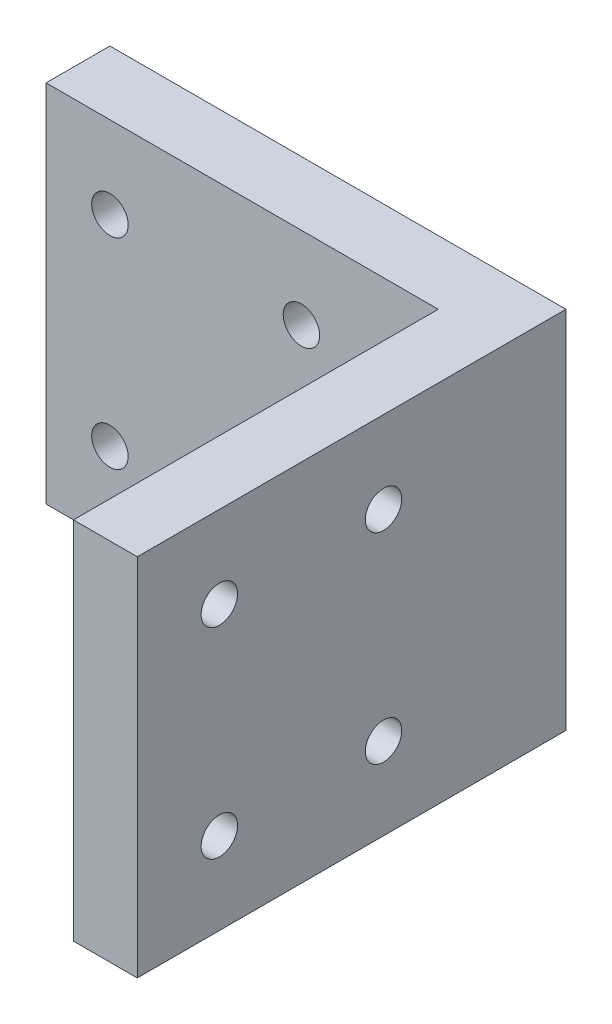
ISO-10303-21;
HEADER;
FILE_DESCRIPTION(('STEP AP214'),'2;1');
FILE_NAME('part.step','',(''),(''),'','','');
FILE_SCHEMA(('AUTOMOTIVE_DESIGN { 1 0 10303 214 1 1 1 1 }'));
ENDSEC;
DATA;
#1=APPLICATION_CONTEXT('core data for automotive mechanical design processes');
#2=APPLICATION_PROTOCOL_DEFINITION('international standard','automotive_design',2000,#1);
#3=PRODUCT_CONTEXT('',#1,'mechanical');
#4=PRODUCT('Part','Part','',(#3));
#5=PRODUCT_RELATED_PRODUCT_CATEGORY('part','',(#4));
#6=PRODUCT_DEFINITION_FORMATION('','',#4);
#7=PRODUCT_DEFINITION_CONTEXT('part definition',#1,'design');
#8=PRODUCT_DEFINITION('design','',#6,#7);
#9=PRODUCT_DEFINITION_SHAPE('','',#8);
#10=(LENGTH_UNIT() NAMED_UNIT(*) SI_UNIT(.MILLI.,.METRE.));
#11=(NAMED_UNIT(*) PLANE_ANGLE_UNIT() SI_UNIT($,.RADIAN.));
#12=(NAMED_UNIT(*) SI_UNIT($,.STERADIAN.) SOLID_ANGLE_UNIT());
#13=UNCERTAINTY_MEASURE_WITH_UNIT(LENGTH_MEASURE(1.E-05),#10,'distance_accuracy_value','');
#14=(GEOMETRIC_REPRESENTATION_CONTEXT(3) GLOBAL_UNCERTAINTY_ASSIGNED_CONTEXT((#13)) GLOBAL_UNIT_ASSIGNED_CONTEXT((#10,
#11,#12)) REPRESENTATION_CONTEXT('',''));
#15=CARTESIAN_POINT('',(0.,0.,0.));
#16=DIRECTION('',(0.,0.,1.));
#17=DIRECTION('',(1.,0.,0.));
#18=AXIS2_PLACEMENT_3D('',#15,#16,#17);
#19=CARTESIAN_POINT('',(-45.2173913043478,8.91304347826087,7.));
#20=DIRECTION('',(1.,0.,0.));
#21=DIRECTION('',(0.,0.,-1.));
#22=AXIS2_PLACEMENT_3D('',#19,#20,#21);
#23=PLANE('',#22);
#24=DIRECTION('',(0.,-1.,0.));
#25=VECTOR('',#24,1.);
#26=CARTESIAN_POINT('',(-45.2173913043478,8.91304347826087,0.));
#27=LINE('',#26,#25);
#28=CARTESIAN_POINT('',(-45.2173913043478,8.91304347826087,0.));
#29=VERTEX_POINT('',#28);
#30=CARTESIAN_POINT('',(-45.2173913043478,-31.0869565217391,0.));
#31=VERTEX_POINT('',#30);
#32=EDGE_CURVE('E91',#29,#31,#27,.T.);
#33=ORIENTED_EDGE('',*,*,#32,.T.);
#34=DIRECTION('',(0.,0.,-1.));
#35=VECTOR('',#34,1.);
#36=CARTESIAN_POINT('',(-45.2173913043478,-31.0869565217391,7.));
#37=LINE('',#36,#35);
#38=CARTESIAN_POINT('',(-45.2173913043478,-31.0869565217391,7.));
#39=VERTEX_POINT('',#38);
#40=EDGE_CURVE('E11',#39,#31,#37,.T.);
#41=ORIENTED_EDGE('',*,*,#40,.F.);
#42=DIRECTION('',(0.,-1.,0.));
#43=VECTOR('',#42,1.);
#44=CARTESIAN_POINT('',(-45.2173913043478,8.91304347826087,7.));
#45=LINE('',#44,#43);
#46=CARTESIAN_POINT('',(-45.2173913043478,8.91304347826087,7.));
#47=VERTEX_POINT('',#46);
#48=EDGE_CURVE('E85',#47,#39,#45,.T.);
#49=ORIENTED_EDGE('',*,*,#48,.F.);
#50=DIRECTION('',(0.,0.,-1.));
#51=VECTOR('',#50,1.);
#52=CARTESIAN_POINT('',(-45.2173913043478,8.91304347826087,7.));
#53=LINE('',#52,#51);
#54=EDGE_CURVE('E77',#47,#29,#53,.T.);
#55=ORIENTED_EDGE('',*,*,#54,.T.);
#56=EDGE_LOOP('',(#33,#41,#49,#55));
#57=FACE_BOUND('',#56,.T.);
#58=ADVANCED_FACE('F33',(#57),#23,.F.);
#59=CARTESIAN_POINT('',(-45.2173913043478,-31.0869565217391,7.));
#60=DIRECTION('',(0.,1.,0.));
#61=DIRECTION('',(0.,0.,1.));
#62=AXIS2_PLACEMENT_3D('',#59,#60,#61);
#63=PLANE('',#62);
#64=DIRECTION('',(1.,0.,0.));
#65=VECTOR('',#64,1.);
#66=CARTESIAN_POINT('',(-45.2173913043478,-31.0869565217391,0.));
#67=LINE('',#66,#65);
#68=CARTESIAN_POINT('',(4.78260869565221,-31.0869565217391,0.));
#69=VERTEX_POINT('',#68);
#70=EDGE_CURVE('E94',#31,#69,#67,.T.);
#71=ORIENTED_EDGE('',*,*,#70,.T.);
#72=DIRECTION('',(0.,0.,-1.));
#73=VECTOR('',#72,1.);
#74=CARTESIAN_POINT('',(4.78260869565221,-31.0869565217391,7.));
#75=LINE('',#74,#73);
#76=CARTESIAN_POINT('',(4.78260869565221,-31.0869565217391,47.));
#77=VERTEX_POINT('',#76);
#78=EDGE_CURVE('E41',#77,#69,#75,.T.);
#79=ORIENTED_EDGE('',*,*,#78,.F.);
#80=DIRECTION('',(1.,0.,0.));
#81=VECTOR('',#80,1.);
#82=CARTESIAN_POINT('',(-2.21739130434779,-31.0869565217391,47.));
#83=LINE('',#82,#81);
#84=CARTESIAN_POINT('',(-2.21739130434779,-31.0869565217391,47.));
#85=VERTEX_POINT('',#84);
#86=EDGE_CURVE('E128',#85,#77,#83,.T.);
#87=ORIENTED_EDGE('',*,*,#86,.F.);
#88=DIRECTION('',(0.,0.,-1.));
#89=VECTOR('',#88,1.);
#90=CARTESIAN_POINT('',(-2.21739130434779,-31.0869565217391,47.));
#91=LINE('',#90,#89);
#92=CARTESIAN_POINT('',(-2.21739130434779,-31.0869565217391,7.));
#93=VERTEX_POINT('',#92);
#94=EDGE_CURVE('E95',#85,#93,#91,.T.);
#95=ORIENTED_EDGE('',*,*,#94,.T.);
#96=DIRECTION('',(1.,0.,0.));
#97=VECTOR('',#96,1.);
#98=CARTESIAN_POINT('',(-45.2173913043478,-31.0869565217391,7.));
#99=LINE('',#98,#97);
#100=EDGE_CURVE('E135',#39,#93,#99,.T.);
#101=ORIENTED_EDGE('',*,*,#100,.F.);
#102=ORIENTED_EDGE('',*,*,#40,.T.);
#103=EDGE_LOOP('',(#71,#79,#87,#95,#101,#102));
#104=FACE_BOUND('',#103,.T.);
#105=ADVANCED_FACE('F140',(#104),#63,.F.);
#106=CARTESIAN_POINT('',(4.7826086956522,8.91304347826087,7.));
#107=DIRECTION('',(-1.,0.,0.));
#108=DIRECTION('',(0.,-1.,0.));
#109=AXIS2_PLACEMENT_3D('',#106,#107,#108);
#110=PLANE('',#109);
#111=CARTESIAN_POINT('',(4.78260869565221,-22.0869565217391,38.));
#112=DIRECTION('',(-1.,0.,0.));
#113=DIRECTION('',(0.,-1.,0.));
#114=AXIS2_PLACEMENT_3D('',#111,#112,#113);
#115=CIRCLE('',#114,2.);
#116=CARTESIAN_POINT('',(4.78260869565221,-24.0869565217391,38.));
#117=VERTEX_POINT('',#116);
#118=EDGE_CURVE('E171',#117,#117,#115,.T.);
#119=ORIENTED_EDGE('',*,*,#118,.T.);
#120=EDGE_LOOP('',(#119));
#121=FACE_BOUND('',#120,.T.);
#122=CARTESIAN_POINT('',(4.7826086956522,-0.0869565217391268,20.));
#123=DIRECTION('',(-1.,0.,0.));
#124=DIRECTION('',(0.,-1.,0.));
#125=AXIS2_PLACEMENT_3D('',#122,#123,#124);
#126=CIRCLE('',#125,2.);
#127=CARTESIAN_POINT('',(4.7826086956522,-2.08695652173913,20.));
#128=VERTEX_POINT('',#127);
#129=EDGE_CURVE('E174',#128,#128,#126,.T.);
#130=ORIENTED_EDGE('',*,*,#129,.T.);
#131=EDGE_LOOP('',(#130));
#132=FACE_BOUND('',#131,.T.);
#133=CARTESIAN_POINT('',(4.78260869565221,-22.0869565217391,20.));
#134=DIRECTION('',(-1.,0.,0.));
#135=DIRECTION('',(0.,-1.,0.));
#136=AXIS2_PLACEMENT_3D('',#133,#134,#135);
#137=CIRCLE('',#136,2.00000000000001);
#138=CARTESIAN_POINT('',(4.78260869565221,-24.0869565217391,20.));
#139=VERTEX_POINT('',#138);
#140=EDGE_CURVE('E177',#139,#139,#137,.T.);
#141=ORIENTED_EDGE('',*,*,#140,.T.);
#142=EDGE_LOOP('',(#141));
#143=FACE_BOUND('',#142,.T.);
#144=CARTESIAN_POINT('',(4.7826086956522,-0.0869565217391246,38.));
#145=DIRECTION('',(-1.,0.,0.));
#146=DIRECTION('',(0.,-1.,0.));
#147=AXIS2_PLACEMENT_3D('',#144,#145,#146);
#148=CIRCLE('',#147,2.);
#149=CARTESIAN_POINT('',(4.7826086956522,-2.08695652173913,38.));
#150=VERTEX_POINT('',#149);
#151=EDGE_CURVE('E180',#150,#150,#148,.T.);
#152=ORIENTED_EDGE('',*,*,#151,.T.);
#153=EDGE_LOOP('',(#152));
#154=FACE_BOUND('',#153,.T.);
#155=DIRECTION('',(0.,1.,0.));
#156=VECTOR('',#155,1.);
#157=CARTESIAN_POINT('',(4.7826086956522,8.91304347826087,0.));
#158=LINE('',#157,#156);
#159=CARTESIAN_POINT('',(4.7826086956522,8.91304347826087,0.));
#160=VERTEX_POINT('',#159);
#161=EDGE_CURVE('E86',#69,#160,#158,.T.);
#162=ORIENTED_EDGE('',*,*,#161,.T.);
#163=DIRECTION('',(0.,0.,-1.));
#164=VECTOR('',#163,1.);
#165=CARTESIAN_POINT('',(4.7826086956522,8.91304347826087,7.));
#166=LINE('',#165,#164);
#167=CARTESIAN_POINT('',(4.78260869565221,8.91304347826087,47.));
#168=VERTEX_POINT('',#167);
#169=EDGE_CURVE('E81',#168,#160,#166,.T.);
#170=ORIENTED_EDGE('',*,*,#169,.F.);
#171=DIRECTION('',(0.,1.,0.));
#172=VECTOR('',#171,1.);
#173=CARTESIAN_POINT('',(4.78260869565221,8.91304347826087,47.));
#174=LINE('',#173,#172);
#175=EDGE_CURVE('E157',#77,#168,#174,.T.);
#176=ORIENTED_EDGE('',*,*,#175,.F.);
#177=ORIENTED_EDGE('',*,*,#78,.T.);
#178=EDGE_LOOP('',(#162,#170,#176,#177));
#179=FACE_BOUND('',#178,.T.);
#180=ADVANCED_FACE('F212',(#121,#132,#143,#154,#179),#110,.F.);
#181=CARTESIAN_POINT('',(-45.2173913043478,8.91304347826087,7.));
#182=DIRECTION('',(0.,-1.,0.));
#183=DIRECTION('',(0.,0.,-1.));
#184=AXIS2_PLACEMENT_3D('',#181,#182,#183);
#185=PLANE('',#184);
#186=DIRECTION('',(-1.,0.,0.));
#187=VECTOR('',#186,1.);
#188=CARTESIAN_POINT('',(-45.2173913043478,8.91304347826087,0.));
#189=LINE('',#188,#187);
#190=EDGE_CURVE('E74',#160,#29,#189,.T.);
#191=ORIENTED_EDGE('',*,*,#190,.T.);
#192=ORIENTED_EDGE('',*,*,#54,.F.);
#193=DIRECTION('',(-1.,0.,0.));
#194=VECTOR('',#193,1.);
#195=CARTESIAN_POINT('',(-45.2173913043478,8.91304347826087,7.));
#196=LINE('',#195,#194);
#197=CARTESIAN_POINT('',(-2.21739130434779,8.91304347826087,7.));
#198=VERTEX_POINT('',#197);
#199=EDGE_CURVE('E54',#198,#47,#196,.T.);
#200=ORIENTED_EDGE('',*,*,#199,.F.);
#201=DIRECTION('',(0.,0.,-1.));
#202=VECTOR('',#201,1.);
#203=CARTESIAN_POINT('',(-2.21739130434779,8.91304347826087,47.));
#204=LINE('',#203,#202);
#205=CARTESIAN_POINT('',(-2.21739130434779,8.91304347826087,47.));
#206=VERTEX_POINT('',#205);
#207=EDGE_CURVE('E99',#206,#198,#204,.T.);
#208=ORIENTED_EDGE('',*,*,#207,.F.);
#209=DIRECTION('',(-1.,0.,0.));
#210=VECTOR('',#209,1.);
#211=CARTESIAN_POINT('',(-2.21739130434779,8.91304347826087,47.));
#212=LINE('',#211,#210);
#213=EDGE_CURVE('E132',#168,#206,#212,.T.);
#214=ORIENTED_EDGE('',*,*,#213,.F.);
#215=ORIENTED_EDGE('',*,*,#169,.T.);
#216=EDGE_LOOP('',(#191,#192,#200,#208,#214,#215));
#217=FACE_BOUND('',#216,.T.);
#218=ADVANCED_FACE('F76',(#217),#185,.F.);
#219=CARTESIAN_POINT('',(0.,0.,7.));
#220=DIRECTION('',(0.,0.,1.));
#221=DIRECTION('',(1.,0.,0.));
#222=AXIS2_PLACEMENT_3D('',#219,#220,#221);
#223=PLANE('',#222);
#224=CARTESIAN_POINT('',(-38.2173913043478,-22.0869565217391,7.));
#225=DIRECTION('',(0.,0.,1.));
#226=DIRECTION('',(1.,0.,0.));
#227=AXIS2_PLACEMENT_3D('',#224,#225,#226);
#228=CIRCLE('',#227,2.);
#229=CARTESIAN_POINT('',(-36.2173913043478,-22.0869565217391,7.));
#230=VERTEX_POINT('',#229);
#231=EDGE_CURVE('E162',#230,#230,#228,.T.);
#232=ORIENTED_EDGE('',*,*,#231,.F.);
#233=EDGE_LOOP('',(#232));
#234=FACE_BOUND('',#233,.T.);
#235=CARTESIAN_POINT('',(-17.2173913043478,-0.0869565217391224,7.));
#236=DIRECTION('',(0.,0.,1.));
#237=DIRECTION('',(1.,0.,0.));
#238=AXIS2_PLACEMENT_3D('',#235,#236,#237);
#239=CIRCLE('',#238,2.);
#240=CARTESIAN_POINT('',(-15.2173913043478,-0.0869565217391224,7.));
#241=VERTEX_POINT('',#240);
#242=EDGE_CURVE('E163',#241,#241,#239,.T.);
#243=ORIENTED_EDGE('',*,*,#242,.F.);
#244=EDGE_LOOP('',(#243));
#245=FACE_BOUND('',#244,.T.);
#246=CARTESIAN_POINT('',(-17.2173913043478,-22.0869565217391,7.));
#247=DIRECTION('',(0.,0.,1.));
#248=DIRECTION('',(1.,0.,0.));
#249=AXIS2_PLACEMENT_3D('',#246,#247,#248);
#250=CIRCLE('',#249,2.);
#251=CARTESIAN_POINT('',(-15.2173913043478,-22.0869565217391,7.));
#252=VERTEX_POINT('',#251);
#253=EDGE_CURVE('E166',#252,#252,#250,.T.);
#254=ORIENTED_EDGE('',*,*,#253,.F.);
#255=EDGE_LOOP('',(#254));
#256=FACE_BOUND('',#255,.T.);
#257=CARTESIAN_POINT('',(-38.2173913043478,-0.086956521739125,7.));
#258=DIRECTION('',(0.,0.,1.));
#259=DIRECTION('',(1.,0.,0.));
#260=AXIS2_PLACEMENT_3D('',#257,#258,#259);
#261=CIRCLE('',#260,2.);
#262=CARTESIAN_POINT('',(-36.2173913043478,-0.086956521739125,7.));
#263=VERTEX_POINT('',#262);
#264=EDGE_CURVE('E112',#263,#263,#261,.T.);
#265=ORIENTED_EDGE('',*,*,#264,.F.);
#266=EDGE_LOOP('',(#265));
#267=FACE_BOUND('',#266,.T.);
#268=DIRECTION('',(0.,-1.,0.));
#269=VECTOR('',#268,1.);
#270=CARTESIAN_POINT('',(-2.21739130434779,8.91304347826087,7.));
#271=LINE('',#270,#269);
#272=EDGE_CURVE('E49',#198,#93,#271,.T.);
#273=ORIENTED_EDGE('',*,*,#272,.F.);
#274=ORIENTED_EDGE('',*,*,#199,.T.);
#275=ORIENTED_EDGE('',*,*,#48,.T.);
#276=ORIENTED_EDGE('',*,*,#100,.T.);
#277=EDGE_LOOP('',(#273,#274,#275,#276));
#278=FACE_BOUND('',#277,.T.);
#279=ADVANCED_FACE('F136',(#234,#245,#256,#267,#278),#223,.T.);
#280=CARTESIAN_POINT('',(0.,0.,0.));
#281=DIRECTION('',(0.,0.,1.));
#282=DIRECTION('',(1.,0.,0.));
#283=AXIS2_PLACEMENT_3D('',#280,#281,#282);
#284=PLANE('',#283);
#285=CARTESIAN_POINT('',(-38.2173913043478,-22.0869565217391,0.));
#286=DIRECTION('',(0.,0.,1.));
#287=DIRECTION('',(1.,0.,0.));
#288=AXIS2_PLACEMENT_3D('',#285,#286,#287);
#289=CIRCLE('',#288,2.);
#290=CARTESIAN_POINT('',(-36.2173913043478,-22.0869565217391,0.));
#291=VERTEX_POINT('',#290);
#292=EDGE_CURVE('E36',#291,#291,#289,.T.);
#293=ORIENTED_EDGE('',*,*,#292,.T.);
#294=EDGE_LOOP('',(#293));
#295=FACE_BOUND('',#294,.T.);
#296=CARTESIAN_POINT('',(-17.2173913043478,-0.0869565217391224,0.));
#297=DIRECTION('',(0.,0.,1.));
#298=DIRECTION('',(1.,0.,0.));
#299=AXIS2_PLACEMENT_3D('',#296,#297,#298);
#300=CIRCLE('',#299,2.);
#301=CARTESIAN_POINT('',(-15.2173913043478,-0.0869565217391224,0.));
#302=VERTEX_POINT('',#301);
#303=EDGE_CURVE('E114',#302,#302,#300,.T.);
#304=ORIENTED_EDGE('',*,*,#303,.T.);
#305=EDGE_LOOP('',(#304));
#306=FACE_BOUND('',#305,.T.);
#307=CARTESIAN_POINT('',(-17.2173913043478,-22.0869565217391,0.));
#308=DIRECTION('',(0.,0.,1.));
#309=DIRECTION('',(1.,0.,0.));
#310=AXIS2_PLACEMENT_3D('',#307,#308,#309);
#311=CIRCLE('',#310,2.);
#312=CARTESIAN_POINT('',(-15.2173913043478,-22.0869565217391,0.));
#313=VERTEX_POINT('',#312);
#314=EDGE_CURVE('E111',#313,#313,#311,.T.);
#315=ORIENTED_EDGE('',*,*,#314,.T.);
#316=EDGE_LOOP('',(#315));
#317=FACE_BOUND('',#316,.T.);
#318=CARTESIAN_POINT('',(-38.2173913043478,-0.086956521739125,0.));
#319=DIRECTION('',(0.,0.,1.));
#320=DIRECTION('',(1.,0.,0.));
#321=AXIS2_PLACEMENT_3D('',#318,#319,#320);
#322=CIRCLE('',#321,2.);
#323=CARTESIAN_POINT('',(-36.2173913043478,-0.086956521739125,0.));
#324=VERTEX_POINT('',#323);
#325=EDGE_CURVE('E108',#324,#324,#322,.T.);
#326=ORIENTED_EDGE('',*,*,#325,.T.);
#327=EDGE_LOOP('',(#326));
#328=FACE_BOUND('',#327,.T.);
#329=ORIENTED_EDGE('',*,*,#32,.F.);
#330=ORIENTED_EDGE('',*,*,#190,.F.);
#331=ORIENTED_EDGE('',*,*,#161,.F.);
#332=ORIENTED_EDGE('',*,*,#70,.F.);
#333=EDGE_LOOP('',(#329,#330,#331,#332));
#334=FACE_BOUND('',#333,.T.);
#335=ADVANCED_FACE('F93',(#295,#306,#317,#328,#334),#284,.F.);
#336=CARTESIAN_POINT('',(-2.21739130434779,8.91304347826087,47.));
#337=DIRECTION('',(1.,0.,0.));
#338=DIRECTION('',(0.,1.,0.));
#339=AXIS2_PLACEMENT_3D('',#336,#337,#338);
#340=PLANE('',#339);
#341=CARTESIAN_POINT('',(-2.21739130434779,-22.0869565217391,38.));
#342=DIRECTION('',(-1.,0.,0.));
#343=DIRECTION('',(0.,-1.,0.));
#344=AXIS2_PLACEMENT_3D('',#341,#342,#343);
#345=CIRCLE('',#344,2.);
#346=CARTESIAN_POINT('',(-2.21739130434779,-24.0869565217391,38.));
#347=VERTEX_POINT('',#346);
#348=EDGE_CURVE('E186',#347,#347,#345,.T.);
#349=ORIENTED_EDGE('',*,*,#348,.F.);
#350=EDGE_LOOP('',(#349));
#351=FACE_BOUND('',#350,.T.);
#352=CARTESIAN_POINT('',(-2.21739130434779,-0.0869565217391274,20.));
#353=DIRECTION('',(-1.,0.,0.));
#354=DIRECTION('',(0.,-1.,0.));
#355=AXIS2_PLACEMENT_3D('',#352,#353,#354);
#356=CIRCLE('',#355,2.);
#357=CARTESIAN_POINT('',(-2.21739130434779,-2.08695652173913,20.));
#358=VERTEX_POINT('',#357);
#359=EDGE_CURVE('E187',#358,#358,#356,.T.);
#360=ORIENTED_EDGE('',*,*,#359,.F.);
#361=EDGE_LOOP('',(#360));
#362=FACE_BOUND('',#361,.T.);
#363=CARTESIAN_POINT('',(-2.21739130434779,-22.0869565217391,20.));
#364=DIRECTION('',(-1.,0.,0.));
#365=DIRECTION('',(0.,-1.,0.));
#366=AXIS2_PLACEMENT_3D('',#363,#364,#365);
#367=CIRCLE('',#366,2.00000000000001);
#368=CARTESIAN_POINT('',(-2.21739130434779,-24.0869565217391,20.));
#369=VERTEX_POINT('',#368);
#370=EDGE_CURVE('E190',#369,#369,#367,.T.);
#371=ORIENTED_EDGE('',*,*,#370,.F.);
#372=EDGE_LOOP('',(#371));
#373=FACE_BOUND('',#372,.T.);
#374=CARTESIAN_POINT('',(-2.21739130434779,-0.0869565217391252,38.));
#375=DIRECTION('',(-1.,0.,0.));
#376=DIRECTION('',(0.,-1.,0.));
#377=AXIS2_PLACEMENT_3D('',#374,#375,#376);
#378=CIRCLE('',#377,2.);
#379=CARTESIAN_POINT('',(-2.21739130434779,-2.08695652173913,38.));
#380=VERTEX_POINT('',#379);
#381=EDGE_CURVE('E183',#380,#380,#378,.T.);
#382=ORIENTED_EDGE('',*,*,#381,.F.);
#383=EDGE_LOOP('',(#382));
#384=FACE_BOUND('',#383,.T.);
#385=ORIENTED_EDGE('',*,*,#272,.T.);
#386=ORIENTED_EDGE('',*,*,#94,.F.);
#387=DIRECTION('',(0.,-1.,0.));
#388=VECTOR('',#387,1.);
#389=CARTESIAN_POINT('',(-2.21739130434779,8.91304347826087,47.));
#390=LINE('',#389,#388);
#391=EDGE_CURVE('E121',#206,#85,#390,.T.);
#392=ORIENTED_EDGE('',*,*,#391,.F.);
#393=ORIENTED_EDGE('',*,*,#207,.T.);
#394=EDGE_LOOP('',(#385,#386,#392,#393));
#395=FACE_BOUND('',#394,.T.);
#396=ADVANCED_FACE('F144',(#351,#362,#373,#384,#395),#340,.F.);
#397=CARTESIAN_POINT('',(0.,0.,47.));
#398=DIRECTION('',(0.,0.,1.));
#399=DIRECTION('',(1.,0.,0.));
#400=AXIS2_PLACEMENT_3D('',#397,#398,#399);
#401=PLANE('',#400);
#402=ORIENTED_EDGE('',*,*,#391,.T.);
#403=ORIENTED_EDGE('',*,*,#86,.T.);
#404=ORIENTED_EDGE('',*,*,#175,.T.);
#405=ORIENTED_EDGE('',*,*,#213,.T.);
#406=EDGE_LOOP('',(#402,#403,#404,#405));
#407=FACE_BOUND('',#406,.T.);
#408=ADVANCED_FACE('F155',(#407),#401,.T.);
#409=CARTESIAN_POINT('',(-38.2173913043478,-0.086956521739125,-33.));
#410=DIRECTION('',(0.,0.,1.));
#411=DIRECTION('',(1.,0.,0.));
#412=AXIS2_PLACEMENT_3D('',#409,#410,#411);
#413=CYLINDRICAL_SURFACE('',#412,2.);
#414=ORIENTED_EDGE('',*,*,#264,.T.);
#415=EDGE_LOOP('',(#414));
#416=FACE_BOUND('',#415,.T.);
#417=ORIENTED_EDGE('',*,*,#325,.F.);
#418=EDGE_LOOP('',(#417));
#419=FACE_BOUND('',#418,.T.);
#420=ADVANCED_FACE('F251',(#416,#419),#413,.F.);
#421=CARTESIAN_POINT('',(-17.2173913043478,-22.0869565217391,-33.));
#422=DIRECTION('',(0.,0.,1.));
#423=DIRECTION('',(1.,0.,0.));
#424=AXIS2_PLACEMENT_3D('',#421,#422,#423);
#425=CYLINDRICAL_SURFACE('',#424,2.);
#426=ORIENTED_EDGE('',*,*,#253,.T.);
#427=EDGE_LOOP('',(#426));
#428=FACE_BOUND('',#427,.T.);
#429=ORIENTED_EDGE('',*,*,#314,.F.);
#430=EDGE_LOOP('',(#429));
#431=FACE_BOUND('',#430,.T.);
#432=ADVANCED_FACE('F275',(#428,#431),#425,.F.);
#433=CARTESIAN_POINT('',(-17.2173913043478,-0.0869565217391224,-33.));
#434=DIRECTION('',(0.,0.,1.));
#435=DIRECTION('',(1.,0.,0.));
#436=AXIS2_PLACEMENT_3D('',#433,#434,#435);
#437=CYLINDRICAL_SURFACE('',#436,2.);
#438=ORIENTED_EDGE('',*,*,#242,.T.);
#439=EDGE_LOOP('',(#438));
#440=FACE_BOUND('',#439,.T.);
#441=ORIENTED_EDGE('',*,*,#303,.F.);
#442=EDGE_LOOP('',(#441));
#443=FACE_BOUND('',#442,.T.);
#444=ADVANCED_FACE('F285',(#440,#443),#437,.F.);
#445=CARTESIAN_POINT('',(-38.2173913043478,-22.0869565217391,-33.));
#446=DIRECTION('',(0.,0.,1.));
#447=DIRECTION('',(1.,0.,0.));
#448=AXIS2_PLACEMENT_3D('',#445,#446,#447);
#449=CYLINDRICAL_SURFACE('',#448,2.);
#450=ORIENTED_EDGE('',*,*,#231,.T.);
#451=EDGE_LOOP('',(#450));
#452=FACE_BOUND('',#451,.T.);
#453=ORIENTED_EDGE('',*,*,#292,.F.);
#454=EDGE_LOOP('',(#453));
#455=FACE_BOUND('',#454,.T.);
#456=ADVANCED_FACE('F208',(#452,#455),#449,.F.);
#457=CARTESIAN_POINT('',(37.7826086956522,-0.0869565217391217,38.));
#458=DIRECTION('',(-1.,0.,0.));
#459=DIRECTION('',(0.,-1.,0.));
#460=AXIS2_PLACEMENT_3D('',#457,#458,#459);
#461=CYLINDRICAL_SURFACE('',#460,2.);
#462=ORIENTED_EDGE('',*,*,#381,.T.);
#463=EDGE_LOOP('',(#462));
#464=FACE_BOUND('',#463,.T.);
#465=ORIENTED_EDGE('',*,*,#151,.F.);
#466=EDGE_LOOP('',(#465));
#467=FACE_BOUND('',#466,.T.);
#468=ADVANCED_FACE('F205',(#464,#467),#461,.F.);
#469=CARTESIAN_POINT('',(37.7826086956522,-22.0869565217391,20.));
#470=DIRECTION('',(-1.,0.,0.));
#471=DIRECTION('',(0.,-1.,0.));
#472=AXIS2_PLACEMENT_3D('',#469,#470,#471);
#473=CYLINDRICAL_SURFACE('',#472,2.00000000000001);
#474=ORIENTED_EDGE('',*,*,#370,.T.);
#475=EDGE_LOOP('',(#474));
#476=FACE_BOUND('',#475,.T.);
#477=ORIENTED_EDGE('',*,*,#140,.F.);
#478=EDGE_LOOP('',(#477));
#479=FACE_BOUND('',#478,.T.);
#480=ADVANCED_FACE('F196',(#476,#479),#473,.F.);
#481=CARTESIAN_POINT('',(37.7826086956522,-0.0869565217391239,20.));
#482=DIRECTION('',(-1.,0.,0.));
#483=DIRECTION('',(0.,-1.,0.));
#484=AXIS2_PLACEMENT_3D('',#481,#482,#483);
#485=CYLINDRICAL_SURFACE('',#484,2.);
#486=ORIENTED_EDGE('',*,*,#359,.T.);
#487=EDGE_LOOP('',(#486));
#488=FACE_BOUND('',#487,.T.);
#489=ORIENTED_EDGE('',*,*,#129,.F.);
#490=EDGE_LOOP('',(#489));
#491=FACE_BOUND('',#490,.T.);
#492=ADVANCED_FACE('F328',(#488,#491),#485,.F.);
#493=CARTESIAN_POINT('',(37.7826086956522,-22.0869565217391,38.));
#494=DIRECTION('',(-1.,0.,0.));
#495=DIRECTION('',(0.,-1.,0.));
#496=AXIS2_PLACEMENT_3D('',#493,#494,#495);
#497=CYLINDRICAL_SURFACE('',#496,2.);
#498=ORIENTED_EDGE('',*,*,#348,.T.);
#499=EDGE_LOOP('',(#498));
#500=FACE_BOUND('',#499,.T.);
#501=ORIENTED_EDGE('',*,*,#118,.F.);
#502=EDGE_LOOP('',(#501));
#503=FACE_BOUND('',#502,.T.);
#504=ADVANCED_FACE('F337',(#500,#503),#497,.F.);
#505=CLOSED_SHELL('',(#58,#105,#180,#218,#279,#335,#396,#408,#420,#432,#444,#456,#468,#480,#492,#504));
#506=MANIFOLD_SOLID_BREP('B2',#505);
#507=ADVANCED_BREP_SHAPE_REPRESENTATION('',(#18,#506),#14);
#508=SHAPE_DEFINITION_REPRESENTATION(#9,#507);
ENDSEC;
END-ISO-10303-21;
